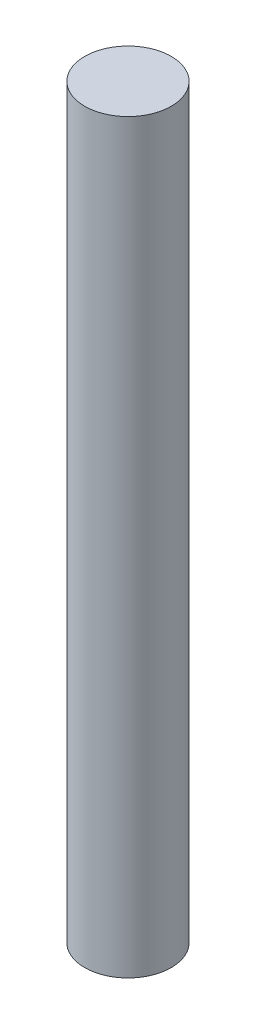
ISO-10303-21;
HEADER;
FILE_DESCRIPTION(('STEP AP214'),'2;1');
FILE_NAME('part.step','',(''),(''),'','','');
FILE_SCHEMA(('AUTOMOTIVE_DESIGN { 1 0 10303 214 1 1 1 1 }'));
ENDSEC;
DATA;
#1=APPLICATION_CONTEXT('core data for automotive mechanical design processes');
#2=APPLICATION_PROTOCOL_DEFINITION('international standard','automotive_design',2000,#1);
#3=PRODUCT_CONTEXT('',#1,'mechanical');
#4=PRODUCT('Part','Part','',(#3));
#5=PRODUCT_RELATED_PRODUCT_CATEGORY('part','',(#4));
#6=PRODUCT_DEFINITION_FORMATION('','',#4);
#7=PRODUCT_DEFINITION_CONTEXT('part definition',#1,'design');
#8=PRODUCT_DEFINITION('design','',#6,#7);
#9=PRODUCT_DEFINITION_SHAPE('','',#8);
#10=(LENGTH_UNIT() NAMED_UNIT(*) SI_UNIT(.MILLI.,.METRE.));
#11=(NAMED_UNIT(*) PLANE_ANGLE_UNIT() SI_UNIT($,.RADIAN.));
#12=(NAMED_UNIT(*) SI_UNIT($,.STERADIAN.) SOLID_ANGLE_UNIT());
#13=UNCERTAINTY_MEASURE_WITH_UNIT(LENGTH_MEASURE(1.E-05),#10,'distance_accuracy_value','');
#14=(GEOMETRIC_REPRESENTATION_CONTEXT(3) GLOBAL_UNCERTAINTY_ASSIGNED_CONTEXT((#13)) GLOBAL_UNIT_ASSIGNED_CONTEXT((#10,
#11,#12)) REPRESENTATION_CONTEXT('',''));
#15=CARTESIAN_POINT('',(0.,0.,0.));
#16=DIRECTION('',(0.,0.,1.));
#17=DIRECTION('',(1.,0.,0.));
#18=AXIS2_PLACEMENT_3D('',#15,#16,#17);
#19=CARTESIAN_POINT('',(0.,69.,0.));
#20=DIRECTION('',(0.,-1.,0.));
#21=DIRECTION('',(0.,0.,-1.));
#22=AXIS2_PLACEMENT_3D('',#19,#20,#21);
#23=CYLINDRICAL_SURFACE('',#22,4.);
#24=CARTESIAN_POINT('',(0.,69.,0.));
#25=DIRECTION('',(0.,1.,0.));
#26=DIRECTION('',(0.,0.,1.));
#27=AXIS2_PLACEMENT_3D('',#24,#25,#26);
#28=CIRCLE('',#27,4.);
#29=CARTESIAN_POINT('',(0.,69.,4.));
#30=VERTEX_POINT('',#29);
#31=EDGE_CURVE('E10',#30,#30,#28,.T.);
#32=ORIENTED_EDGE('',*,*,#31,.F.);
#33=EDGE_LOOP('',(#32));
#34=FACE_BOUND('',#33,.T.);
#35=CARTESIAN_POINT('',(0.,0.,0.));
#36=DIRECTION('',(0.,1.,0.));
#37=DIRECTION('',(0.,0.,1.));
#38=AXIS2_PLACEMENT_3D('',#35,#36,#37);
#39=CIRCLE('',#38,4.);
#40=CARTESIAN_POINT('',(0.,0.,4.));
#41=VERTEX_POINT('',#40);
#42=EDGE_CURVE('E40',#41,#41,#39,.T.);
#43=ORIENTED_EDGE('',*,*,#42,.T.);
#44=EDGE_LOOP('',(#43));
#45=FACE_BOUND('',#44,.T.);
#46=ADVANCED_FACE('F37',(#34,#45),#23,.T.);
#47=CARTESIAN_POINT('',(0.,69.,0.));
#48=DIRECTION('',(0.,1.,0.));
#49=DIRECTION('',(0.,0.,1.));
#50=AXIS2_PLACEMENT_3D('',#47,#48,#49);
#51=PLANE('',#50);
#52=ORIENTED_EDGE('',*,*,#31,.T.);
#53=EDGE_LOOP('',(#52));
#54=FACE_BOUND('',#53,.T.);
#55=ADVANCED_FACE('F54',(#54),#51,.T.);
#56=CARTESIAN_POINT('',(0.,0.,0.));
#57=DIRECTION('',(0.,1.,0.));
#58=DIRECTION('',(0.,0.,1.));
#59=AXIS2_PLACEMENT_3D('',#56,#57,#58);
#60=PLANE('',#59);
#61=ORIENTED_EDGE('',*,*,#42,.F.);
#62=EDGE_LOOP('',(#61));
#63=FACE_BOUND('',#62,.T.);
#64=ADVANCED_FACE('F52',(#63),#60,.F.);
#65=CLOSED_SHELL('',(#46,#55,#64));
#66=MANIFOLD_SOLID_BREP('B2',#65);
#67=ADVANCED_BREP_SHAPE_REPRESENTATION('',(#18,#66),#14);
#68=SHAPE_DEFINITION_REPRESENTATION(#9,#67);
ENDSEC;
END-ISO-10303-21;
